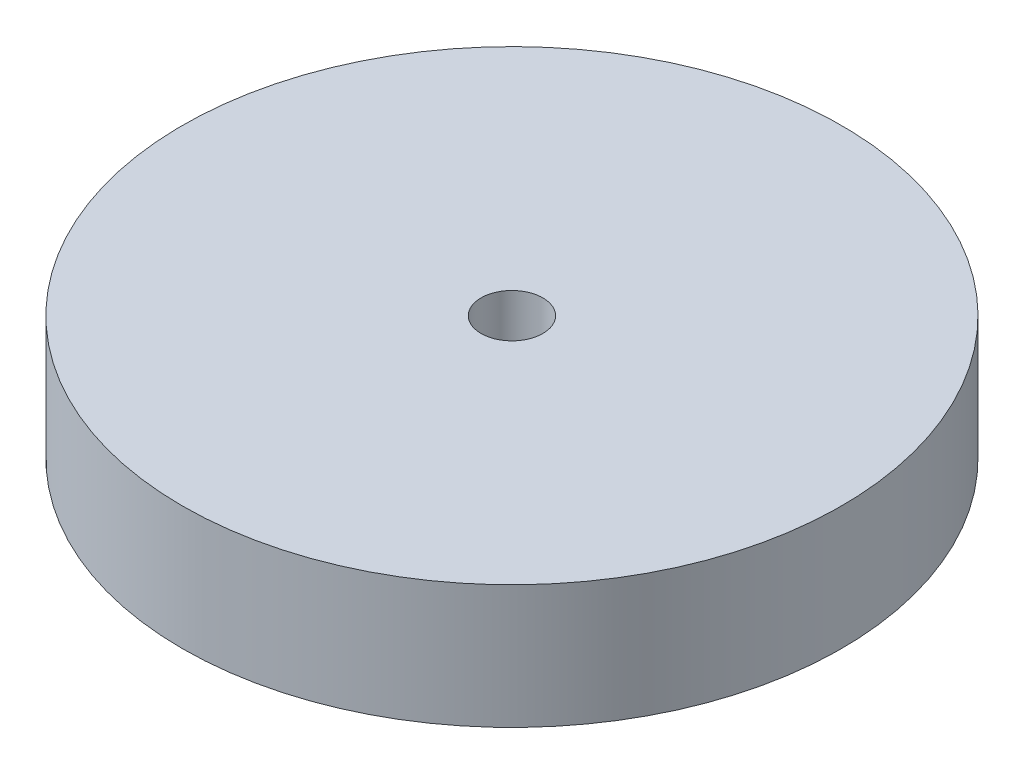
ISO-10303-21;
HEADER;
FILE_DESCRIPTION(('STEP AP214'),'2;1');
FILE_NAME('part.step','',(''),(''),'','','');
FILE_SCHEMA(('AUTOMOTIVE_DESIGN { 1 0 10303 214 1 1 1 1 }'));
ENDSEC;
DATA;
#1=APPLICATION_CONTEXT('core data for automotive mechanical design processes');
#2=APPLICATION_PROTOCOL_DEFINITION('international standard','automotive_design',2000,#1);
#3=PRODUCT_CONTEXT('',#1,'mechanical');
#4=PRODUCT('Part','Part','',(#3));
#5=PRODUCT_RELATED_PRODUCT_CATEGORY('part','',(#4));
#6=PRODUCT_DEFINITION_FORMATION('','',#4);
#7=PRODUCT_DEFINITION_CONTEXT('part definition',#1,'design');
#8=PRODUCT_DEFINITION('design','',#6,#7);
#9=PRODUCT_DEFINITION_SHAPE('','',#8);
#10=(LENGTH_UNIT() NAMED_UNIT(*) SI_UNIT(.MILLI.,.METRE.));
#11=(NAMED_UNIT(*) PLANE_ANGLE_UNIT() SI_UNIT($,.RADIAN.));
#12=(NAMED_UNIT(*) SI_UNIT($,.STERADIAN.) SOLID_ANGLE_UNIT());
#13=UNCERTAINTY_MEASURE_WITH_UNIT(LENGTH_MEASURE(1.E-05),#10,'distance_accuracy_value','');
#14=(GEOMETRIC_REPRESENTATION_CONTEXT(3) GLOBAL_UNCERTAINTY_ASSIGNED_CONTEXT((#13)) GLOBAL_UNIT_ASSIGNED_CONTEXT((#10,
#11,#12)) REPRESENTATION_CONTEXT('',''));
#15=CARTESIAN_POINT('',(0.,0.,0.));
#16=DIRECTION('',(0.,0.,1.));
#17=DIRECTION('',(1.,0.,0.));
#18=AXIS2_PLACEMENT_3D('',#15,#16,#17);
#19=CARTESIAN_POINT('',(0.,30.,0.));
#20=DIRECTION('',(0.,1.,0.));
#21=DIRECTION('',(0.,0.,1.));
#22=AXIS2_PLACEMENT_3D('',#19,#20,#21);
#23=PLANE('',#22);
#24=CARTESIAN_POINT('',(0.,30.,0.));
#25=DIRECTION('',(0.,1.,0.));
#26=DIRECTION('',(0.,0.,1.));
#27=AXIS2_PLACEMENT_3D('',#24,#25,#26);
#28=CIRCLE('',#27,160.);
#29=CARTESIAN_POINT('',(0.,30.,160.));
#30=VERTEX_POINT('',#29);
#31=EDGE_CURVE('E10',#30,#30,#28,.T.);
#32=ORIENTED_EDGE('',*,*,#31,.T.);
#33=EDGE_LOOP('',(#32));
#34=FACE_BOUND('',#33,.T.);
#35=CARTESIAN_POINT('',(0.,30.,0.));
#36=DIRECTION('',(0.,1.,0.));
#37=DIRECTION('',(0.,0.,1.));
#38=AXIS2_PLACEMENT_3D('',#35,#36,#37);
#39=CIRCLE('',#38,15.);
#40=CARTESIAN_POINT('',(0.,30.,15.));
#41=VERTEX_POINT('',#40);
#42=EDGE_CURVE('E41',#41,#41,#39,.T.);
#43=ORIENTED_EDGE('',*,*,#42,.F.);
#44=EDGE_LOOP('',(#43));
#45=FACE_BOUND('',#44,.T.);
#46=ADVANCED_FACE('F30',(#34,#45),#23,.T.);
#47=CARTESIAN_POINT('',(0.,-30.,0.));
#48=DIRECTION('',(0.,1.,0.));
#49=DIRECTION('',(0.,0.,1.));
#50=AXIS2_PLACEMENT_3D('',#47,#48,#49);
#51=PLANE('',#50);
#52=CARTESIAN_POINT('',(0.,-30.,0.));
#53=DIRECTION('',(0.,1.,0.));
#54=DIRECTION('',(0.,0.,1.));
#55=AXIS2_PLACEMENT_3D('',#52,#53,#54);
#56=CIRCLE('',#55,160.);
#57=CARTESIAN_POINT('',(0.,-30.,160.));
#58=VERTEX_POINT('',#57);
#59=EDGE_CURVE('E34',#58,#58,#56,.T.);
#60=ORIENTED_EDGE('',*,*,#59,.F.);
#61=EDGE_LOOP('',(#60));
#62=FACE_BOUND('',#61,.T.);
#63=CARTESIAN_POINT('',(0.,-30.,0.));
#64=DIRECTION('',(0.,1.,0.));
#65=DIRECTION('',(0.,0.,1.));
#66=AXIS2_PLACEMENT_3D('',#63,#64,#65);
#67=CIRCLE('',#66,15.);
#68=CARTESIAN_POINT('',(0.,-30.,15.));
#69=VERTEX_POINT('',#68);
#70=EDGE_CURVE('E43',#69,#69,#67,.T.);
#71=ORIENTED_EDGE('',*,*,#70,.T.);
#72=EDGE_LOOP('',(#71));
#73=FACE_BOUND('',#72,.T.);
#74=ADVANCED_FACE('F53',(#62,#73),#51,.F.);
#75=CARTESIAN_POINT('',(0.,30.,0.));
#76=DIRECTION('',(0.,-1.,0.));
#77=DIRECTION('',(0.,0.,-1.));
#78=AXIS2_PLACEMENT_3D('',#75,#76,#77);
#79=CYLINDRICAL_SURFACE('',#78,160.);
#80=ORIENTED_EDGE('',*,*,#31,.F.);
#81=EDGE_LOOP('',(#80));
#82=FACE_BOUND('',#81,.T.);
#83=ORIENTED_EDGE('',*,*,#59,.T.);
#84=EDGE_LOOP('',(#83));
#85=FACE_BOUND('',#84,.T.);
#86=ADVANCED_FACE('F32',(#82,#85),#79,.T.);
#87=CARTESIAN_POINT('',(0.,30.,0.));
#88=DIRECTION('',(0.,-1.,0.));
#89=DIRECTION('',(0.,0.,-1.));
#90=AXIS2_PLACEMENT_3D('',#87,#88,#89);
#91=CYLINDRICAL_SURFACE('',#90,15.);
#92=ORIENTED_EDGE('',*,*,#42,.T.);
#93=EDGE_LOOP('',(#92));
#94=FACE_BOUND('',#93,.T.);
#95=ORIENTED_EDGE('',*,*,#70,.F.);
#96=EDGE_LOOP('',(#95));
#97=FACE_BOUND('',#96,.T.);
#98=ADVANCED_FACE('F49',(#94,#97),#91,.F.);
#99=CLOSED_SHELL('',(#46,#74,#86,#98));
#100=MANIFOLD_SOLID_BREP('B2',#99);
#101=ADVANCED_BREP_SHAPE_REPRESENTATION('',(#18,#100),#14);
#102=SHAPE_DEFINITION_REPRESENTATION(#9,#101);
ENDSEC;
END-ISO-10303-21;
